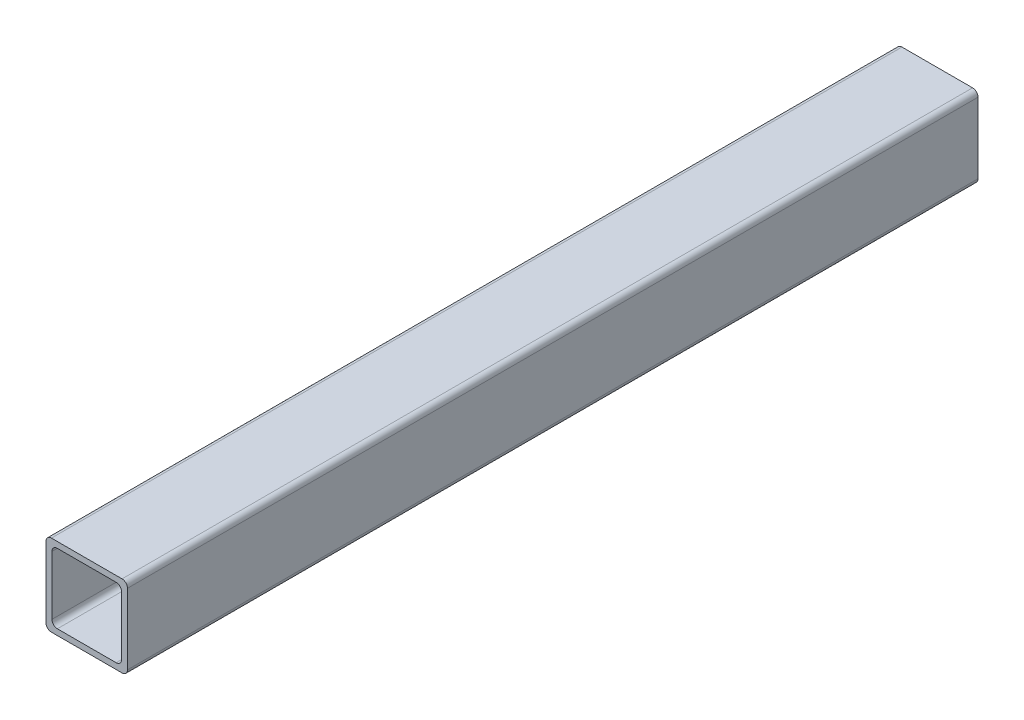
ISO-10303-21;
HEADER;
FILE_DESCRIPTION(('STEP AP214'),'2;1');
FILE_NAME('part.step','',(''),(''),'','','');
FILE_SCHEMA(('AUTOMOTIVE_DESIGN { 1 0 10303 214 1 1 1 1 }'));
ENDSEC;
DATA;
#1=APPLICATION_CONTEXT('core data for automotive mechanical design processes');
#2=APPLICATION_PROTOCOL_DEFINITION('international standard','automotive_design',2000,#1);
#3=PRODUCT_CONTEXT('',#1,'mechanical');
#4=PRODUCT('Part','Part','',(#3));
#5=PRODUCT_RELATED_PRODUCT_CATEGORY('part','',(#4));
#6=PRODUCT_DEFINITION_FORMATION('','',#4);
#7=PRODUCT_DEFINITION_CONTEXT('part definition',#1,'design');
#8=PRODUCT_DEFINITION('design','',#6,#7);
#9=PRODUCT_DEFINITION_SHAPE('','',#8);
#10=(LENGTH_UNIT() NAMED_UNIT(*) SI_UNIT(.MILLI.,.METRE.));
#11=(NAMED_UNIT(*) PLANE_ANGLE_UNIT() SI_UNIT($,.RADIAN.));
#12=(NAMED_UNIT(*) SI_UNIT($,.STERADIAN.) SOLID_ANGLE_UNIT());
#13=UNCERTAINTY_MEASURE_WITH_UNIT(LENGTH_MEASURE(1.E-05),#10,'distance_accuracy_value','');
#14=(GEOMETRIC_REPRESENTATION_CONTEXT(3) GLOBAL_UNCERTAINTY_ASSIGNED_CONTEXT((#13)) GLOBAL_UNIT_ASSIGNED_CONTEXT((#10,
#11,#12)) REPRESENTATION_CONTEXT('',''));
#15=CARTESIAN_POINT('',(0.,0.,0.));
#16=DIRECTION('',(0.,0.,1.));
#17=DIRECTION('',(1.,0.,0.));
#18=AXIS2_PLACEMENT_3D('',#15,#16,#17);
#19=CARTESIAN_POINT('',(2.54,-35.56,397.));
#20=DIRECTION('',(0.,0.,1.));
#21=DIRECTION('',(1.,0.,0.));
#22=AXIS2_PLACEMENT_3D('',#19,#20,#21);
#23=PLANE('',#22);
#24=CARTESIAN_POINT('',(2.54,-35.56,397.));
#25=DIRECTION('',(0.,0.,1.));
#26=DIRECTION('',(1.,0.,0.));
#27=AXIS2_PLACEMENT_3D('',#24,#25,#26);
#28=CIRCLE('',#27,2.54);
#29=CARTESIAN_POINT('',(0.,-35.56,397.));
#30=VERTEX_POINT('',#29);
#31=CARTESIAN_POINT('',(2.54000000000002,-38.1,397.));
#32=VERTEX_POINT('',#31);
#33=EDGE_CURVE('E243',#30,#32,#28,.T.);
#34=ORIENTED_EDGE('',*,*,#33,.T.);
#35=DIRECTION('',(1.,0.,0.));
#36=VECTOR('',#35,1.);
#37=CARTESIAN_POINT('',(2.54000000000002,-38.1,397.));
#38=LINE('',#37,#36);
#39=CARTESIAN_POINT('',(35.56,-38.1,397.));
#40=VERTEX_POINT('',#39);
#41=EDGE_CURVE('E245',#32,#40,#38,.T.);
#42=ORIENTED_EDGE('',*,*,#41,.T.);
#43=CARTESIAN_POINT('',(35.56,-35.56,397.));
#44=DIRECTION('',(0.,0.,1.));
#45=DIRECTION('',(-1.,0.,0.));
#46=AXIS2_PLACEMENT_3D('',#43,#44,#45);
#47=CIRCLE('',#46,2.54);
#48=CARTESIAN_POINT('',(38.1,-35.56,397.));
#49=VERTEX_POINT('',#48);
#50=EDGE_CURVE('E156',#40,#49,#47,.T.);
#51=ORIENTED_EDGE('',*,*,#50,.T.);
#52=DIRECTION('',(0.,1.,0.));
#53=VECTOR('',#52,1.);
#54=CARTESIAN_POINT('',(38.1,-2.54000000000002,397.));
#55=LINE('',#54,#53);
#56=CARTESIAN_POINT('',(38.1,-2.54000000000002,397.));
#57=VERTEX_POINT('',#56);
#58=EDGE_CURVE('E248',#49,#57,#55,.T.);
#59=ORIENTED_EDGE('',*,*,#58,.T.);
#60=CARTESIAN_POINT('',(35.56,-2.54,397.));
#61=DIRECTION('',(0.,0.,1.));
#62=DIRECTION('',(1.,0.,0.));
#63=AXIS2_PLACEMENT_3D('',#60,#61,#62);
#64=CIRCLE('',#63,2.54);
#65=CARTESIAN_POINT('',(35.56,0.,397.));
#66=VERTEX_POINT('',#65);
#67=EDGE_CURVE('E250',#57,#66,#64,.T.);
#68=ORIENTED_EDGE('',*,*,#67,.T.);
#69=DIRECTION('',(-1.,0.,0.));
#70=VECTOR('',#69,1.);
#71=CARTESIAN_POINT('',(2.54000000000002,0.,397.));
#72=LINE('',#71,#70);
#73=CARTESIAN_POINT('',(2.54000000000002,0.,397.));
#74=VERTEX_POINT('',#73);
#75=EDGE_CURVE('E252',#66,#74,#72,.T.);
#76=ORIENTED_EDGE('',*,*,#75,.T.);
#77=CARTESIAN_POINT('',(2.54,-2.54,397.));
#78=DIRECTION('',(0.,0.,1.));
#79=DIRECTION('',(-1.,0.,0.));
#80=AXIS2_PLACEMENT_3D('',#77,#78,#79);
#81=CIRCLE('',#80,2.54);
#82=CARTESIAN_POINT('',(0.,-2.54000000000002,397.));
#83=VERTEX_POINT('',#82);
#84=EDGE_CURVE('E254',#74,#83,#81,.T.);
#85=ORIENTED_EDGE('',*,*,#84,.T.);
#86=DIRECTION('',(0.,-1.,0.));
#87=VECTOR('',#86,1.);
#88=CARTESIAN_POINT('',(0.,-2.54000000000002,397.));
#89=LINE('',#88,#87);
#90=EDGE_CURVE('E59',#83,#30,#89,.T.);
#91=ORIENTED_EDGE('',*,*,#90,.T.);
#92=EDGE_LOOP('',(#34,#42,#51,#59,#68,#76,#85,#91));
#93=FACE_BOUND('',#92,.T.);
#94=DIRECTION('',(1.,0.,0.));
#95=VECTOR('',#94,1.);
#96=CARTESIAN_POINT('',(5.30860000000002,-35.3314,397.));
#97=LINE('',#96,#95);
#98=CARTESIAN_POINT('',(5.30860000000002,-35.3314,397.));
#99=VERTEX_POINT('',#98);
#100=CARTESIAN_POINT('',(32.7914,-35.3314,397.));
#101=VERTEX_POINT('',#100);
#102=EDGE_CURVE('E193',#99,#101,#97,.T.);
#103=ORIENTED_EDGE('',*,*,#102,.F.);
#104=CARTESIAN_POINT('',(5.3086,-32.7914,397.));
#105=DIRECTION('',(0.,0.,1.));
#106=DIRECTION('',(1.,0.,0.));
#107=AXIS2_PLACEMENT_3D('',#104,#105,#106);
#108=CIRCLE('',#107,2.54);
#109=CARTESIAN_POINT('',(2.7686,-32.7914,397.));
#110=VERTEX_POINT('',#109);
#111=EDGE_CURVE('E191',#110,#99,#108,.T.);
#112=ORIENTED_EDGE('',*,*,#111,.F.);
#113=DIRECTION('',(0.,-1.,0.));
#114=VECTOR('',#113,1.);
#115=CARTESIAN_POINT('',(2.7686,-5.30860000000002,397.));
#116=LINE('',#115,#114);
#117=CARTESIAN_POINT('',(2.7686,-5.30860000000002,397.));
#118=VERTEX_POINT('',#117);
#119=EDGE_CURVE('E206',#118,#110,#116,.T.);
#120=ORIENTED_EDGE('',*,*,#119,.F.);
#121=CARTESIAN_POINT('',(5.3086,-5.3086,397.));
#122=DIRECTION('',(0.,0.,1.));
#123=DIRECTION('',(1.,0.,0.));
#124=AXIS2_PLACEMENT_3D('',#121,#122,#123);
#125=CIRCLE('',#124,2.54);
#126=CARTESIAN_POINT('',(5.30860000000002,-2.7686,397.));
#127=VERTEX_POINT('',#126);
#128=EDGE_CURVE('E204',#127,#118,#125,.T.);
#129=ORIENTED_EDGE('',*,*,#128,.F.);
#130=DIRECTION('',(-1.,0.,0.));
#131=VECTOR('',#130,1.);
#132=CARTESIAN_POINT('',(5.30860000000002,-2.7686,397.));
#133=LINE('',#132,#131);
#134=CARTESIAN_POINT('',(32.7914,-2.7686,397.));
#135=VERTEX_POINT('',#134);
#136=EDGE_CURVE('E202',#135,#127,#133,.T.);
#137=ORIENTED_EDGE('',*,*,#136,.F.);
#138=CARTESIAN_POINT('',(32.7914,-5.3086,397.));
#139=DIRECTION('',(0.,0.,1.));
#140=DIRECTION('',(1.,0.,0.));
#141=AXIS2_PLACEMENT_3D('',#138,#139,#140);
#142=CIRCLE('',#141,2.54);
#143=CARTESIAN_POINT('',(35.3314,-5.30860000000002,397.));
#144=VERTEX_POINT('',#143);
#145=EDGE_CURVE('E200',#144,#135,#142,.T.);
#146=ORIENTED_EDGE('',*,*,#145,.F.);
#147=DIRECTION('',(0.,1.,0.));
#148=VECTOR('',#147,1.);
#149=CARTESIAN_POINT('',(35.3314,-5.30860000000002,397.));
#150=LINE('',#149,#148);
#151=CARTESIAN_POINT('',(35.3314,-32.7914,397.));
#152=VERTEX_POINT('',#151);
#153=EDGE_CURVE('E198',#152,#144,#150,.T.);
#154=ORIENTED_EDGE('',*,*,#153,.F.);
#155=CARTESIAN_POINT('',(32.7914,-32.7914,397.));
#156=DIRECTION('',(0.,0.,1.));
#157=DIRECTION('',(1.,0.,0.));
#158=AXIS2_PLACEMENT_3D('',#155,#156,#157);
#159=CIRCLE('',#158,2.54);
#160=EDGE_CURVE('E196',#101,#152,#159,.T.);
#161=ORIENTED_EDGE('',*,*,#160,.F.);
#162=EDGE_LOOP('',(#103,#112,#120,#129,#137,#146,#154,#161));
#163=FACE_BOUND('',#162,.T.);
#164=ADVANCED_FACE('F36',(#93,#163),#23,.T.);
#165=CARTESIAN_POINT('',(2.54,-35.56,397.));
#166=DIRECTION('',(0.,0.,-1.));
#167=DIRECTION('',(-1.,0.,0.));
#168=AXIS2_PLACEMENT_3D('',#165,#166,#167);
#169=CYLINDRICAL_SURFACE('',#168,2.54);
#170=DIRECTION('',(0.,0.,-1.));
#171=VECTOR('',#170,1.);
#172=CARTESIAN_POINT('',(0.,-35.56,397.));
#173=LINE('',#172,#171);
#174=CARTESIAN_POINT('',(0.,-35.56,-0.678713738284209));
#175=VERTEX_POINT('',#174);
#176=EDGE_CURVE('E257',#30,#175,#173,.T.);
#177=ORIENTED_EDGE('',*,*,#176,.T.);
#178=CARTESIAN_POINT('',(2.54,-35.56,-0.678713738284209));
#179=DIRECTION('',(0.,0.,-1.));
#180=DIRECTION('',(-1.,0.,0.));
#181=AXIS2_PLACEMENT_3D('',#178,#179,#180);
#182=CIRCLE('',#181,2.54);
#183=CARTESIAN_POINT('',(2.54000000000002,-38.1,-0.678713738284209));
#184=VERTEX_POINT('',#183);
#185=EDGE_CURVE('E166',#184,#175,#182,.T.);
#186=ORIENTED_EDGE('',*,*,#185,.F.);
#187=DIRECTION('',(0.,0.,-1.));
#188=VECTOR('',#187,1.);
#189=CARTESIAN_POINT('',(2.54000000000002,-38.1,397.));
#190=LINE('',#189,#188);
#191=EDGE_CURVE('E11',#32,#184,#190,.T.);
#192=ORIENTED_EDGE('',*,*,#191,.F.);
#193=ORIENTED_EDGE('',*,*,#33,.F.);
#194=EDGE_LOOP('',(#177,#186,#192,#193));
#195=FACE_BOUND('',#194,.T.);
#196=ADVANCED_FACE('F38',(#195),#169,.T.);
#197=CARTESIAN_POINT('',(2.54000000000002,-38.1,397.));
#198=DIRECTION('',(0.,1.,0.));
#199=DIRECTION('',(0.,0.,1.));
#200=AXIS2_PLACEMENT_3D('',#197,#198,#199);
#201=PLANE('',#200);
#202=ORIENTED_EDGE('',*,*,#191,.T.);
#203=DIRECTION('',(-1.,0.,0.));
#204=VECTOR('',#203,1.);
#205=CARTESIAN_POINT('',(35.56,-38.1,-0.678713738284209));
#206=LINE('',#205,#204);
#207=CARTESIAN_POINT('',(35.56,-38.1,-0.678713738284209));
#208=VERTEX_POINT('',#207);
#209=EDGE_CURVE('E160',#208,#184,#206,.T.);
#210=ORIENTED_EDGE('',*,*,#209,.F.);
#211=DIRECTION('',(0.,0.,-1.));
#212=VECTOR('',#211,1.);
#213=CARTESIAN_POINT('',(35.56,-38.1,397.));
#214=LINE('',#213,#212);
#215=EDGE_CURVE('E44',#40,#208,#214,.T.);
#216=ORIENTED_EDGE('',*,*,#215,.F.);
#217=ORIENTED_EDGE('',*,*,#41,.F.);
#218=EDGE_LOOP('',(#202,#210,#216,#217));
#219=FACE_BOUND('',#218,.T.);
#220=ADVANCED_FACE('F161',(#219),#201,.F.);
#221=CARTESIAN_POINT('',(35.56,-35.56,397.));
#222=DIRECTION('',(0.,0.,-1.));
#223=DIRECTION('',(-1.,0.,0.));
#224=AXIS2_PLACEMENT_3D('',#221,#222,#223);
#225=CYLINDRICAL_SURFACE('',#224,2.54);
#226=ORIENTED_EDGE('',*,*,#215,.T.);
#227=CARTESIAN_POINT('',(35.56,-35.56,-0.678713738284209));
#228=DIRECTION('',(0.,0.,-1.));
#229=DIRECTION('',(-1.,0.,0.));
#230=AXIS2_PLACEMENT_3D('',#227,#228,#229);
#231=CIRCLE('',#230,2.54);
#232=CARTESIAN_POINT('',(38.1,-35.56,-0.678713738284209));
#233=VERTEX_POINT('',#232);
#234=EDGE_CURVE('E154',#233,#208,#231,.T.);
#235=ORIENTED_EDGE('',*,*,#234,.F.);
#236=DIRECTION('',(0.,0.,-1.));
#237=VECTOR('',#236,1.);
#238=CARTESIAN_POINT('',(38.1,-35.56,397.));
#239=LINE('',#238,#237);
#240=EDGE_CURVE('E158',#49,#233,#239,.T.);
#241=ORIENTED_EDGE('',*,*,#240,.F.);
#242=ORIENTED_EDGE('',*,*,#50,.F.);
#243=EDGE_LOOP('',(#226,#235,#241,#242));
#244=FACE_BOUND('',#243,.T.);
#245=ADVANCED_FACE('F151',(#244),#225,.T.);
#246=CARTESIAN_POINT('',(38.1,-2.54000000000002,397.));
#247=DIRECTION('',(-1.,0.,0.));
#248=DIRECTION('',(0.,-1.,0.));
#249=AXIS2_PLACEMENT_3D('',#246,#247,#248);
#250=PLANE('',#249);
#251=ORIENTED_EDGE('',*,*,#240,.T.);
#252=DIRECTION('',(0.,-1.,0.));
#253=VECTOR('',#252,1.);
#254=CARTESIAN_POINT('',(38.1,-2.54000000000002,-0.678713738284209));
#255=LINE('',#254,#253);
#256=CARTESIAN_POINT('',(38.1,-2.54000000000002,-0.678713738284209));
#257=VERTEX_POINT('',#256);
#258=EDGE_CURVE('E171',#257,#233,#255,.T.);
#259=ORIENTED_EDGE('',*,*,#258,.F.);
#260=DIRECTION('',(0.,0.,-1.));
#261=VECTOR('',#260,1.);
#262=CARTESIAN_POINT('',(38.1,-2.54000000000002,397.));
#263=LINE('',#262,#261);
#264=EDGE_CURVE('E265',#57,#257,#263,.T.);
#265=ORIENTED_EDGE('',*,*,#264,.F.);
#266=ORIENTED_EDGE('',*,*,#58,.F.);
#267=EDGE_LOOP('',(#251,#259,#265,#266));
#268=FACE_BOUND('',#267,.T.);
#269=ADVANCED_FACE('F269',(#268),#250,.F.);
#270=CARTESIAN_POINT('',(35.56,-2.54,397.));
#271=DIRECTION('',(0.,0.,-1.));
#272=DIRECTION('',(-1.,0.,0.));
#273=AXIS2_PLACEMENT_3D('',#270,#271,#272);
#274=CYLINDRICAL_SURFACE('',#273,2.54);
#275=ORIENTED_EDGE('',*,*,#264,.T.);
#276=CARTESIAN_POINT('',(35.56,-2.54,-0.678713738284209));
#277=DIRECTION('',(0.,0.,-1.));
#278=DIRECTION('',(-1.,0.,0.));
#279=AXIS2_PLACEMENT_3D('',#276,#277,#278);
#280=CIRCLE('',#279,2.54);
#281=CARTESIAN_POINT('',(35.56,0.,-0.678713738284209));
#282=VERTEX_POINT('',#281);
#283=EDGE_CURVE('E177',#282,#257,#280,.T.);
#284=ORIENTED_EDGE('',*,*,#283,.F.);
#285=DIRECTION('',(0.,0.,-1.));
#286=VECTOR('',#285,1.);
#287=CARTESIAN_POINT('',(35.56,0.,397.));
#288=LINE('',#287,#286);
#289=EDGE_CURVE('E263',#66,#282,#288,.T.);
#290=ORIENTED_EDGE('',*,*,#289,.F.);
#291=ORIENTED_EDGE('',*,*,#67,.F.);
#292=EDGE_LOOP('',(#275,#284,#290,#291));
#293=FACE_BOUND('',#292,.T.);
#294=ADVANCED_FACE('F291',(#293),#274,.T.);
#295=CARTESIAN_POINT('',(2.54000000000002,0.,397.));
#296=DIRECTION('',(0.,-1.,0.));
#297=DIRECTION('',(0.,0.,-1.));
#298=AXIS2_PLACEMENT_3D('',#295,#296,#297);
#299=PLANE('',#298);
#300=ORIENTED_EDGE('',*,*,#289,.T.);
#301=DIRECTION('',(1.,0.,0.));
#302=VECTOR('',#301,1.);
#303=CARTESIAN_POINT('',(2.54000000000002,0.,-0.678713738284209));
#304=LINE('',#303,#302);
#305=CARTESIAN_POINT('',(2.54000000000002,0.,-0.678713738284209));
#306=VERTEX_POINT('',#305);
#307=EDGE_CURVE('E181',#306,#282,#304,.T.);
#308=ORIENTED_EDGE('',*,*,#307,.F.);
#309=DIRECTION('',(0.,0.,-1.));
#310=VECTOR('',#309,1.);
#311=CARTESIAN_POINT('',(2.54000000000002,0.,397.));
#312=LINE('',#311,#310);
#313=EDGE_CURVE('E261',#74,#306,#312,.T.);
#314=ORIENTED_EDGE('',*,*,#313,.F.);
#315=ORIENTED_EDGE('',*,*,#75,.F.);
#316=EDGE_LOOP('',(#300,#308,#314,#315));
#317=FACE_BOUND('',#316,.T.);
#318=ADVANCED_FACE('F288',(#317),#299,.F.);
#319=CARTESIAN_POINT('',(2.54,-2.54,397.));
#320=DIRECTION('',(0.,0.,-1.));
#321=DIRECTION('',(-1.,0.,0.));
#322=AXIS2_PLACEMENT_3D('',#319,#320,#321);
#323=CYLINDRICAL_SURFACE('',#322,2.54);
#324=ORIENTED_EDGE('',*,*,#313,.T.);
#325=CARTESIAN_POINT('',(2.54,-2.54,-0.678713738284209));
#326=DIRECTION('',(0.,0.,-1.));
#327=DIRECTION('',(-1.,0.,0.));
#328=AXIS2_PLACEMENT_3D('',#325,#326,#327);
#329=CIRCLE('',#328,2.54);
#330=CARTESIAN_POINT('',(0.,-2.54000000000002,-0.678713738284209));
#331=VERTEX_POINT('',#330);
#332=EDGE_CURVE('E184',#331,#306,#329,.T.);
#333=ORIENTED_EDGE('',*,*,#332,.F.);
#334=DIRECTION('',(0.,0.,-1.));
#335=VECTOR('',#334,1.);
#336=CARTESIAN_POINT('',(0.,-2.54000000000002,397.));
#337=LINE('',#336,#335);
#338=EDGE_CURVE('E259',#83,#331,#337,.T.);
#339=ORIENTED_EDGE('',*,*,#338,.F.);
#340=ORIENTED_EDGE('',*,*,#84,.F.);
#341=EDGE_LOOP('',(#324,#333,#339,#340));
#342=FACE_BOUND('',#341,.T.);
#343=ADVANCED_FACE('F283',(#342),#323,.T.);
#344=CARTESIAN_POINT('',(0.,-2.54000000000002,397.));
#345=DIRECTION('',(1.,0.,0.));
#346=DIRECTION('',(0.,1.,0.));
#347=AXIS2_PLACEMENT_3D('',#344,#345,#346);
#348=PLANE('',#347);
#349=ORIENTED_EDGE('',*,*,#338,.T.);
#350=DIRECTION('',(0.,1.,0.));
#351=VECTOR('',#350,1.);
#352=CARTESIAN_POINT('',(0.,-35.56,-0.678713738284209));
#353=LINE('',#352,#351);
#354=EDGE_CURVE('E187',#175,#331,#353,.T.);
#355=ORIENTED_EDGE('',*,*,#354,.F.);
#356=ORIENTED_EDGE('',*,*,#176,.F.);
#357=ORIENTED_EDGE('',*,*,#90,.F.);
#358=EDGE_LOOP('',(#349,#355,#356,#357));
#359=FACE_BOUND('',#358,.T.);
#360=ADVANCED_FACE('F279',(#359),#348,.F.);
#361=CARTESIAN_POINT('',(5.3086,-32.7914,397.));
#362=DIRECTION('',(0.,0.,-1.));
#363=DIRECTION('',(-1.,0.,0.));
#364=AXIS2_PLACEMENT_3D('',#361,#362,#363);
#365=CYLINDRICAL_SURFACE('',#364,2.54);
#366=CARTESIAN_POINT('',(5.3086,-32.7914,0.));
#367=DIRECTION('',(0.,0.,1.));
#368=DIRECTION('',(1.,0.,0.));
#369=AXIS2_PLACEMENT_3D('',#366,#367,#368);
#370=CIRCLE('',#369,2.54);
#371=CARTESIAN_POINT('',(2.7686,-32.7914,0.));
#372=VERTEX_POINT('',#371);
#373=CARTESIAN_POINT('',(5.30860000000002,-35.3314,0.));
#374=VERTEX_POINT('',#373);
#375=EDGE_CURVE('E172',#372,#374,#370,.T.);
#376=ORIENTED_EDGE('',*,*,#375,.F.);
#377=DIRECTION('',(0.,0.,-1.));
#378=VECTOR('',#377,1.);
#379=CARTESIAN_POINT('',(2.7686,-32.7914,397.));
#380=LINE('',#379,#378);
#381=EDGE_CURVE('E207',#110,#372,#380,.T.);
#382=ORIENTED_EDGE('',*,*,#381,.F.);
#383=ORIENTED_EDGE('',*,*,#111,.T.);
#384=DIRECTION('',(0.,0.,-1.));
#385=VECTOR('',#384,1.);
#386=CARTESIAN_POINT('',(5.30860000000002,-35.3314,397.));
#387=LINE('',#386,#385);
#388=EDGE_CURVE('E240',#99,#374,#387,.T.);
#389=ORIENTED_EDGE('',*,*,#388,.T.);
#390=EDGE_LOOP('',(#376,#382,#383,#389));
#391=FACE_BOUND('',#390,.T.);
#392=ADVANCED_FACE('F307',(#391),#365,.F.);
#393=CARTESIAN_POINT('',(5.30860000000002,-35.3314,397.));
#394=DIRECTION('',(0.,1.,0.));
#395=DIRECTION('',(0.,0.,1.));
#396=AXIS2_PLACEMENT_3D('',#393,#394,#395);
#397=PLANE('',#396);
#398=DIRECTION('',(1.,0.,0.));
#399=VECTOR('',#398,1.);
#400=CARTESIAN_POINT('',(5.30860000000002,-35.3314,0.));
#401=LINE('',#400,#399);
#402=CARTESIAN_POINT('',(32.7914,-35.3314,0.));
#403=VERTEX_POINT('',#402);
#404=EDGE_CURVE('E175',#374,#403,#401,.T.);
#405=ORIENTED_EDGE('',*,*,#404,.F.);
#406=ORIENTED_EDGE('',*,*,#388,.F.);
#407=ORIENTED_EDGE('',*,*,#102,.T.);
#408=DIRECTION('',(0.,0.,-1.));
#409=VECTOR('',#408,1.);
#410=CARTESIAN_POINT('',(32.7914,-35.3314,397.));
#411=LINE('',#410,#409);
#412=EDGE_CURVE('E238',#101,#403,#411,.T.);
#413=ORIENTED_EDGE('',*,*,#412,.T.);
#414=EDGE_LOOP('',(#405,#406,#407,#413));
#415=FACE_BOUND('',#414,.T.);
#416=ADVANCED_FACE('F326',(#415),#397,.T.);
#417=CARTESIAN_POINT('',(32.7914,-32.7914,397.));
#418=DIRECTION('',(0.,0.,-1.));
#419=DIRECTION('',(-1.,0.,0.));
#420=AXIS2_PLACEMENT_3D('',#417,#418,#419);
#421=CYLINDRICAL_SURFACE('',#420,2.54);
#422=CARTESIAN_POINT('',(32.7914,-32.7914,0.));
#423=DIRECTION('',(0.,0.,1.));
#424=DIRECTION('',(1.,0.,0.));
#425=AXIS2_PLACEMENT_3D('',#422,#423,#424);
#426=CIRCLE('',#425,2.54);
#427=CARTESIAN_POINT('',(35.3314,-32.7914,0.));
#428=VERTEX_POINT('',#427);
#429=EDGE_CURVE('E211',#403,#428,#426,.T.);
#430=ORIENTED_EDGE('',*,*,#429,.F.);
#431=ORIENTED_EDGE('',*,*,#412,.F.);
#432=ORIENTED_EDGE('',*,*,#160,.T.);
#433=DIRECTION('',(0.,0.,-1.));
#434=VECTOR('',#433,1.);
#435=CARTESIAN_POINT('',(35.3314,-32.7914,397.));
#436=LINE('',#435,#434);
#437=EDGE_CURVE('E236',#152,#428,#436,.T.);
#438=ORIENTED_EDGE('',*,*,#437,.T.);
#439=EDGE_LOOP('',(#430,#431,#432,#438));
#440=FACE_BOUND('',#439,.T.);
#441=ADVANCED_FACE('F333',(#440),#421,.F.);
#442=CARTESIAN_POINT('',(35.3314,-5.30860000000002,397.));
#443=DIRECTION('',(-1.,0.,0.));
#444=DIRECTION('',(0.,0.,1.));
#445=AXIS2_PLACEMENT_3D('',#442,#443,#444);
#446=PLANE('',#445);
#447=DIRECTION('',(0.,1.,0.));
#448=VECTOR('',#447,1.);
#449=CARTESIAN_POINT('',(35.3314,-5.30860000000002,0.));
#450=LINE('',#449,#448);
#451=CARTESIAN_POINT('',(35.3314,-5.30860000000002,0.));
#452=VERTEX_POINT('',#451);
#453=EDGE_CURVE('E214',#428,#452,#450,.T.);
#454=ORIENTED_EDGE('',*,*,#453,.F.);
#455=ORIENTED_EDGE('',*,*,#437,.F.);
#456=ORIENTED_EDGE('',*,*,#153,.T.);
#457=DIRECTION('',(0.,0.,-1.));
#458=VECTOR('',#457,1.);
#459=CARTESIAN_POINT('',(35.3314,-5.30860000000002,397.));
#460=LINE('',#459,#458);
#461=EDGE_CURVE('E234',#144,#452,#460,.T.);
#462=ORIENTED_EDGE('',*,*,#461,.T.);
#463=EDGE_LOOP('',(#454,#455,#456,#462));
#464=FACE_BOUND('',#463,.T.);
#465=ADVANCED_FACE('F340',(#464),#446,.T.);
#466=CARTESIAN_POINT('',(32.7914,-5.3086,397.));
#467=DIRECTION('',(0.,0.,-1.));
#468=DIRECTION('',(-1.,0.,0.));
#469=AXIS2_PLACEMENT_3D('',#466,#467,#468);
#470=CYLINDRICAL_SURFACE('',#469,2.54);
#471=CARTESIAN_POINT('',(32.7914,-5.3086,0.));
#472=DIRECTION('',(0.,0.,1.));
#473=DIRECTION('',(1.,0.,0.));
#474=AXIS2_PLACEMENT_3D('',#471,#472,#473);
#475=CIRCLE('',#474,2.54);
#476=CARTESIAN_POINT('',(32.7914,-2.7686,0.));
#477=VERTEX_POINT('',#476);
#478=EDGE_CURVE('E217',#452,#477,#475,.T.);
#479=ORIENTED_EDGE('',*,*,#478,.F.);
#480=ORIENTED_EDGE('',*,*,#461,.F.);
#481=ORIENTED_EDGE('',*,*,#145,.T.);
#482=DIRECTION('',(0.,0.,-1.));
#483=VECTOR('',#482,1.);
#484=CARTESIAN_POINT('',(32.7914,-2.7686,397.));
#485=LINE('',#484,#483);
#486=EDGE_CURVE('E232',#135,#477,#485,.T.);
#487=ORIENTED_EDGE('',*,*,#486,.T.);
#488=EDGE_LOOP('',(#479,#480,#481,#487));
#489=FACE_BOUND('',#488,.T.);
#490=ADVANCED_FACE('F348',(#489),#470,.F.);
#491=CARTESIAN_POINT('',(5.30860000000002,-2.7686,397.));
#492=DIRECTION('',(0.,-1.,0.));
#493=DIRECTION('',(0.,0.,-1.));
#494=AXIS2_PLACEMENT_3D('',#491,#492,#493);
#495=PLANE('',#494);
#496=DIRECTION('',(-1.,0.,0.));
#497=VECTOR('',#496,1.);
#498=CARTESIAN_POINT('',(5.30860000000002,-2.7686,0.));
#499=LINE('',#498,#497);
#500=CARTESIAN_POINT('',(5.30860000000002,-2.7686,0.));
#501=VERTEX_POINT('',#500);
#502=EDGE_CURVE('E220',#477,#501,#499,.T.);
#503=ORIENTED_EDGE('',*,*,#502,.F.);
#504=ORIENTED_EDGE('',*,*,#486,.F.);
#505=ORIENTED_EDGE('',*,*,#136,.T.);
#506=DIRECTION('',(0.,0.,-1.));
#507=VECTOR('',#506,1.);
#508=CARTESIAN_POINT('',(5.30860000000002,-2.7686,397.));
#509=LINE('',#508,#507);
#510=EDGE_CURVE('E230',#127,#501,#509,.T.);
#511=ORIENTED_EDGE('',*,*,#510,.T.);
#512=EDGE_LOOP('',(#503,#504,#505,#511));
#513=FACE_BOUND('',#512,.T.);
#514=ADVANCED_FACE('F356',(#513),#495,.T.);
#515=CARTESIAN_POINT('',(5.3086,-5.3086,397.));
#516=DIRECTION('',(0.,0.,-1.));
#517=DIRECTION('',(-1.,0.,0.));
#518=AXIS2_PLACEMENT_3D('',#515,#516,#517);
#519=CYLINDRICAL_SURFACE('',#518,2.54);
#520=CARTESIAN_POINT('',(5.3086,-5.3086,0.));
#521=DIRECTION('',(0.,0.,1.));
#522=DIRECTION('',(1.,0.,0.));
#523=AXIS2_PLACEMENT_3D('',#520,#521,#522);
#524=CIRCLE('',#523,2.54);
#525=CARTESIAN_POINT('',(2.7686,-5.30860000000002,0.));
#526=VERTEX_POINT('',#525);
#527=EDGE_CURVE('E223',#501,#526,#524,.T.);
#528=ORIENTED_EDGE('',*,*,#527,.F.);
#529=ORIENTED_EDGE('',*,*,#510,.F.);
#530=ORIENTED_EDGE('',*,*,#128,.T.);
#531=DIRECTION('',(0.,0.,-1.));
#532=VECTOR('',#531,1.);
#533=CARTESIAN_POINT('',(2.7686,-5.30860000000002,397.));
#534=LINE('',#533,#532);
#535=EDGE_CURVE('E51',#118,#526,#534,.T.);
#536=ORIENTED_EDGE('',*,*,#535,.T.);
#537=EDGE_LOOP('',(#528,#529,#530,#536));
#538=FACE_BOUND('',#537,.T.);
#539=ADVANCED_FACE('F364',(#538),#519,.F.);
#540=CARTESIAN_POINT('',(2.7686,-5.30860000000002,397.));
#541=DIRECTION('',(1.,0.,0.));
#542=DIRECTION('',(0.,0.,-1.));
#543=AXIS2_PLACEMENT_3D('',#540,#541,#542);
#544=PLANE('',#543);
#545=DIRECTION('',(0.,-1.,0.));
#546=VECTOR('',#545,1.);
#547=CARTESIAN_POINT('',(2.7686,-5.30860000000002,0.));
#548=LINE('',#547,#546);
#549=EDGE_CURVE('E194',#526,#372,#548,.T.);
#550=ORIENTED_EDGE('',*,*,#549,.F.);
#551=ORIENTED_EDGE('',*,*,#535,.F.);
#552=ORIENTED_EDGE('',*,*,#119,.T.);
#553=ORIENTED_EDGE('',*,*,#381,.T.);
#554=EDGE_LOOP('',(#550,#551,#552,#553));
#555=FACE_BOUND('',#554,.T.);
#556=ADVANCED_FACE('F372',(#555),#544,.T.);
#557=CARTESIAN_POINT('',(2.54,-35.56,0.));
#558=DIRECTION('',(0.,0.,-1.));
#559=DIRECTION('',(-1.,0.,0.));
#560=AXIS2_PLACEMENT_3D('',#557,#558,#559);
#561=PLANE('',#560);
#562=ORIENTED_EDGE('',*,*,#375,.T.);
#563=ORIENTED_EDGE('',*,*,#404,.T.);
#564=ORIENTED_EDGE('',*,*,#429,.T.);
#565=ORIENTED_EDGE('',*,*,#453,.T.);
#566=ORIENTED_EDGE('',*,*,#478,.T.);
#567=ORIENTED_EDGE('',*,*,#502,.T.);
#568=ORIENTED_EDGE('',*,*,#527,.T.);
#569=ORIENTED_EDGE('',*,*,#549,.T.);
#570=EDGE_LOOP('',(#562,#563,#564,#565,#566,#567,#568,#569));
#571=FACE_BOUND('',#570,.T.);
#572=ADVANCED_FACE('F380',(#571),#561,.F.);
#573=CARTESIAN_POINT('',(2.54000000005315,19.9999999999996,-0.678713738284209));
#574=DIRECTION('',(0.,0.,-1.));
#575=DIRECTION('',(0.,1.,0.));
#576=AXIS2_PLACEMENT_3D('',#573,#574,#575);
#577=PLANE('',#576);
#578=ORIENTED_EDGE('',*,*,#209,.T.);
#579=ORIENTED_EDGE('',*,*,#185,.T.);
#580=ORIENTED_EDGE('',*,*,#354,.T.);
#581=ORIENTED_EDGE('',*,*,#332,.T.);
#582=ORIENTED_EDGE('',*,*,#307,.T.);
#583=ORIENTED_EDGE('',*,*,#283,.T.);
#584=ORIENTED_EDGE('',*,*,#258,.T.);
#585=ORIENTED_EDGE('',*,*,#234,.T.);
#586=EDGE_LOOP('',(#578,#579,#580,#581,#582,#583,#584,#585));
#587=FACE_BOUND('',#586,.T.);
#588=ADVANCED_FACE('F168',(#587),#577,.T.);
#589=CLOSED_SHELL('',(#164,#196,#220,#245,#269,#294,#318,#343,#360,#392,#416,#441,#465,#490,
#514,#539,#556,#572,#588));
#590=MANIFOLD_SOLID_BREP('B2',#589);
#591=ADVANCED_BREP_SHAPE_REPRESENTATION('',(#18,#590),#14);
#592=SHAPE_DEFINITION_REPRESENTATION(#9,#591);
ENDSEC;
END-ISO-10303-21;
